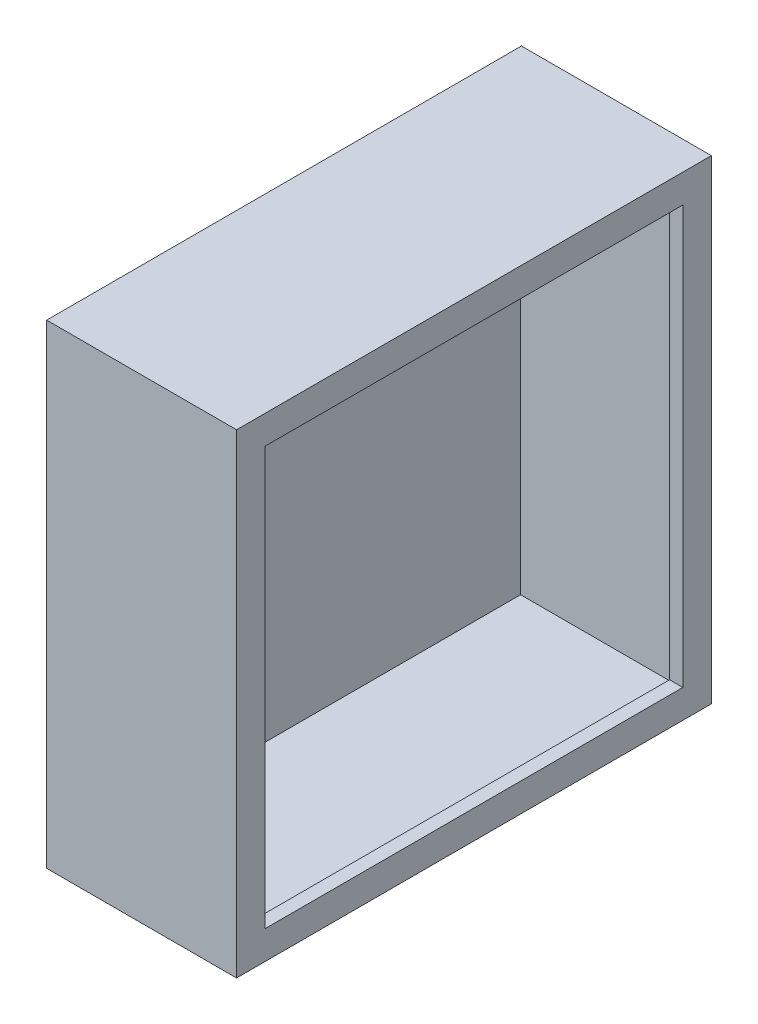
ISO-10303-21;
HEADER;
FILE_DESCRIPTION(('STEP AP214'),'2;1');
FILE_NAME('part.step','',(''),(''),'','','');
FILE_SCHEMA(('AUTOMOTIVE_DESIGN { 1 0 10303 214 1 1 1 1 }'));
ENDSEC;
DATA;
#1=APPLICATION_CONTEXT('core data for automotive mechanical design processes');
#2=APPLICATION_PROTOCOL_DEFINITION('international standard','automotive_design',2000,#1);
#3=PRODUCT_CONTEXT('',#1,'mechanical');
#4=PRODUCT('Part','Part','',(#3));
#5=PRODUCT_RELATED_PRODUCT_CATEGORY('part','',(#4));
#6=PRODUCT_DEFINITION_FORMATION('','',#4);
#7=PRODUCT_DEFINITION_CONTEXT('part definition',#1,'design');
#8=PRODUCT_DEFINITION('design','',#6,#7);
#9=PRODUCT_DEFINITION_SHAPE('','',#8);
#10=(LENGTH_UNIT() NAMED_UNIT(*) SI_UNIT(.MILLI.,.METRE.));
#11=(NAMED_UNIT(*) PLANE_ANGLE_UNIT() SI_UNIT($,.RADIAN.));
#12=(NAMED_UNIT(*) SI_UNIT($,.STERADIAN.) SOLID_ANGLE_UNIT());
#13=UNCERTAINTY_MEASURE_WITH_UNIT(LENGTH_MEASURE(1.E-05),#10,'distance_accuracy_value','');
#14=(GEOMETRIC_REPRESENTATION_CONTEXT(3) GLOBAL_UNCERTAINTY_ASSIGNED_CONTEXT((#13)) GLOBAL_UNIT_ASSIGNED_CONTEXT((#10,
#11,#12)) REPRESENTATION_CONTEXT('',''));
#15=CARTESIAN_POINT('',(0.,0.,0.));
#16=DIRECTION('',(0.,0.,1.));
#17=DIRECTION('',(1.,0.,0.));
#18=AXIS2_PLACEMENT_3D('',#15,#16,#17);
#19=CARTESIAN_POINT('',(40.,60.1781542541157,43.6548223350254));
#20=DIRECTION('',(0.,0.,-1.));
#21=DIRECTION('',(-1.,0.,0.));
#22=AXIS2_PLACEMENT_3D('',#19,#20,#21);
#23=PLANE('',#22);
#24=DIRECTION('',(-1.,0.,0.));
#25=VECTOR('',#24,1.);
#26=CARTESIAN_POINT('',(40.,-39.8218457458843,43.6548223350254));
#27=LINE('',#26,#25);
#28=CARTESIAN_POINT('',(40.,-39.8218457458843,43.6548223350254));
#29=VERTEX_POINT('',#28);
#30=CARTESIAN_POINT('',(0.,-39.8218457458843,43.6548223350254));
#31=VERTEX_POINT('',#30);
#32=EDGE_CURVE('E172',#29,#31,#27,.T.);
#33=ORIENTED_EDGE('',*,*,#32,.F.);
#34=DIRECTION('',(0.,-1.,0.));
#35=VECTOR('',#34,1.);
#36=CARTESIAN_POINT('',(40.,60.1781542541157,43.6548223350254));
#37=LINE('',#36,#35);
#38=CARTESIAN_POINT('',(40.,60.1781542541157,43.6548223350254));
#39=VERTEX_POINT('',#38);
#40=EDGE_CURVE('E187',#39,#29,#37,.T.);
#41=ORIENTED_EDGE('',*,*,#40,.F.);
#42=DIRECTION('',(-1.,0.,0.));
#43=VECTOR('',#42,1.);
#44=CARTESIAN_POINT('',(40.,60.1781542541157,43.6548223350254));
#45=LINE('',#44,#43);
#46=CARTESIAN_POINT('',(0.,60.1781542541157,43.6548223350254));
#47=VERTEX_POINT('',#46);
#48=EDGE_CURVE('E181',#39,#47,#45,.T.);
#49=ORIENTED_EDGE('',*,*,#48,.T.);
#50=DIRECTION('',(0.,-1.,0.));
#51=VECTOR('',#50,1.);
#52=CARTESIAN_POINT('',(0.,60.1781542541157,43.6548223350254));
#53=LINE('',#52,#51);
#54=EDGE_CURVE('E192',#47,#31,#53,.T.);
#55=ORIENTED_EDGE('',*,*,#54,.T.);
#56=EDGE_LOOP('',(#33,#41,#49,#55));
#57=FACE_BOUND('',#56,.T.);
#58=ADVANCED_FACE('F38',(#57),#23,.F.);
#59=CARTESIAN_POINT('',(40.,-39.8218457458843,43.6548223350254));
#60=DIRECTION('',(0.,1.,0.));
#61=DIRECTION('',(0.,0.,1.));
#62=AXIS2_PLACEMENT_3D('',#59,#60,#61);
#63=PLANE('',#62);
#64=DIRECTION('',(-1.,0.,0.));
#65=VECTOR('',#64,1.);
#66=CARTESIAN_POINT('',(40.,-39.8218457458843,-56.3451776649746));
#67=LINE('',#66,#65);
#68=CARTESIAN_POINT('',(40.,-39.8218457458843,-56.3451776649746));
#69=VERTEX_POINT('',#68);
#70=CARTESIAN_POINT('',(0.,-39.8218457458843,-56.3451776649746));
#71=VERTEX_POINT('',#70);
#72=EDGE_CURVE('E175',#69,#71,#67,.T.);
#73=ORIENTED_EDGE('',*,*,#72,.F.);
#74=DIRECTION('',(0.,0.,-1.));
#75=VECTOR('',#74,1.);
#76=CARTESIAN_POINT('',(40.,-39.8218457458843,43.6548223350254));
#77=LINE('',#76,#75);
#78=EDGE_CURVE('E199',#29,#69,#77,.T.);
#79=ORIENTED_EDGE('',*,*,#78,.F.);
#80=ORIENTED_EDGE('',*,*,#32,.T.);
#81=DIRECTION('',(0.,0.,-1.));
#82=VECTOR('',#81,1.);
#83=CARTESIAN_POINT('',(0.,-39.8218457458843,43.6548223350254));
#84=LINE('',#83,#82);
#85=EDGE_CURVE('E190',#31,#71,#84,.T.);
#86=ORIENTED_EDGE('',*,*,#85,.T.);
#87=EDGE_LOOP('',(#73,#79,#80,#86));
#88=FACE_BOUND('',#87,.T.);
#89=ADVANCED_FACE('F291',(#88),#63,.F.);
#90=CARTESIAN_POINT('',(40.,60.1781542541157,-56.3451776649746));
#91=DIRECTION('',(0.,0.,1.));
#92=DIRECTION('',(1.,0.,0.));
#93=AXIS2_PLACEMENT_3D('',#90,#91,#92);
#94=PLANE('',#93);
#95=DIRECTION('',(-1.,0.,0.));
#96=VECTOR('',#95,1.);
#97=CARTESIAN_POINT('',(40.,60.1781542541157,-56.3451776649746));
#98=LINE('',#97,#96);
#99=CARTESIAN_POINT('',(40.,60.1781542541157,-56.3451776649746));
#100=VERTEX_POINT('',#99);
#101=CARTESIAN_POINT('',(0.,60.1781542541157,-56.3451776649746));
#102=VERTEX_POINT('',#101);
#103=EDGE_CURVE('E178',#100,#102,#98,.T.);
#104=ORIENTED_EDGE('',*,*,#103,.F.);
#105=DIRECTION('',(0.,1.,0.));
#106=VECTOR('',#105,1.);
#107=CARTESIAN_POINT('',(40.,60.1781542541157,-56.3451776649746));
#108=LINE('',#107,#106);
#109=EDGE_CURVE('E197',#69,#100,#108,.T.);
#110=ORIENTED_EDGE('',*,*,#109,.F.);
#111=ORIENTED_EDGE('',*,*,#72,.T.);
#112=DIRECTION('',(0.,1.,0.));
#113=VECTOR('',#112,1.);
#114=CARTESIAN_POINT('',(0.,60.1781542541157,-56.3451776649746));
#115=LINE('',#114,#113);
#116=EDGE_CURVE('E188',#71,#102,#115,.T.);
#117=ORIENTED_EDGE('',*,*,#116,.T.);
#118=EDGE_LOOP('',(#104,#110,#111,#117));
#119=FACE_BOUND('',#118,.T.);
#120=ADVANCED_FACE('F296',(#119),#94,.F.);
#121=CARTESIAN_POINT('',(40.,60.1781542541157,43.6548223350254));
#122=DIRECTION('',(0.,-1.,0.));
#123=DIRECTION('',(0.,0.,-1.));
#124=AXIS2_PLACEMENT_3D('',#121,#122,#123);
#125=PLANE('',#124);
#126=ORIENTED_EDGE('',*,*,#48,.F.);
#127=DIRECTION('',(0.,0.,1.));
#128=VECTOR('',#127,1.);
#129=CARTESIAN_POINT('',(40.,60.1781542541157,43.6548223350254));
#130=LINE('',#129,#128);
#131=EDGE_CURVE('E184',#100,#39,#130,.T.);
#132=ORIENTED_EDGE('',*,*,#131,.F.);
#133=ORIENTED_EDGE('',*,*,#103,.T.);
#134=DIRECTION('',(0.,0.,1.));
#135=VECTOR('',#134,1.);
#136=CARTESIAN_POINT('',(0.,60.1781542541157,43.6548223350254));
#137=LINE('',#136,#135);
#138=EDGE_CURVE('E185',#102,#47,#137,.T.);
#139=ORIENTED_EDGE('',*,*,#138,.T.);
#140=EDGE_LOOP('',(#126,#132,#133,#139));
#141=FACE_BOUND('',#140,.T.);
#142=ADVANCED_FACE('F309',(#141),#125,.F.);
#143=CARTESIAN_POINT('',(40.,0.,0.));
#144=DIRECTION('',(1.,0.,0.));
#145=DIRECTION('',(0.,0.,-1.));
#146=AXIS2_PLACEMENT_3D('',#143,#144,#145);
#147=PLANE('',#146);
#148=ORIENTED_EDGE('',*,*,#131,.T.);
#149=ORIENTED_EDGE('',*,*,#40,.T.);
#150=ORIENTED_EDGE('',*,*,#78,.T.);
#151=ORIENTED_EDGE('',*,*,#109,.T.);
#152=EDGE_LOOP('',(#148,#149,#150,#151));
#153=FACE_BOUND('',#152,.T.);
#154=DIRECTION('',(0.,1.,0.));
#155=VECTOR('',#154,1.);
#156=CARTESIAN_POINT('',(40.,0.,37.6548223350254));
#157=LINE('',#156,#155);
#158=CARTESIAN_POINT('',(40.,-33.8218457458843,37.6548223350254));
#159=VERTEX_POINT('',#158);
#160=CARTESIAN_POINT('',(40.,54.1781542541157,37.6548223350254));
#161=VERTEX_POINT('',#160);
#162=EDGE_CURVE('E229',#159,#161,#157,.T.);
#163=ORIENTED_EDGE('',*,*,#162,.T.);
#164=DIRECTION('',(0.,0.,-1.));
#165=VECTOR('',#164,1.);
#166=CARTESIAN_POINT('',(40.,54.1781542541157,40.8361807320889));
#167=LINE('',#166,#165);
#168=CARTESIAN_POINT('',(40.,54.1781542541157,-50.3451776649746));
#169=VERTEX_POINT('',#168);
#170=EDGE_CURVE('E153',#161,#169,#167,.T.);
#171=ORIENTED_EDGE('',*,*,#170,.T.);
#172=DIRECTION('',(0.,-1.,0.));
#173=VECTOR('',#172,1.);
#174=CARTESIAN_POINT('',(40.,54.1781542541157,-50.3451776649746));
#175=LINE('',#174,#173);
#176=CARTESIAN_POINT('',(40.,-33.8218457458843,-50.3451776649746));
#177=VERTEX_POINT('',#176);
#178=EDGE_CURVE('E239',#169,#177,#175,.T.);
#179=ORIENTED_EDGE('',*,*,#178,.T.);
#180=DIRECTION('',(0.,0.,1.));
#181=VECTOR('',#180,1.);
#182=CARTESIAN_POINT('',(40.,-33.8218457458843,0.));
#183=LINE('',#182,#181);
#184=EDGE_CURVE('E253',#177,#159,#183,.T.);
#185=ORIENTED_EDGE('',*,*,#184,.T.);
#186=EDGE_LOOP('',(#163,#171,#179,#185));
#187=FACE_BOUND('',#186,.T.);
#188=ADVANCED_FACE('F264',(#153,#187),#147,.T.);
#189=CARTESIAN_POINT('',(0.,0.,0.));
#190=DIRECTION('',(1.,0.,0.));
#191=DIRECTION('',(0.,0.,-1.));
#192=AXIS2_PLACEMENT_3D('',#189,#190,#191);
#193=PLANE('',#192);
#194=ORIENTED_EDGE('',*,*,#54,.F.);
#195=ORIENTED_EDGE('',*,*,#138,.F.);
#196=ORIENTED_EDGE('',*,*,#116,.F.);
#197=ORIENTED_EDGE('',*,*,#85,.F.);
#198=EDGE_LOOP('',(#194,#195,#196,#197));
#199=FACE_BOUND('',#198,.T.);
#200=ADVANCED_FACE('F312',(#199),#193,.F.);
#201=CARTESIAN_POINT('',(2.99999999999998,57.1781542541157,-53.1638192679111));
#202=DIRECTION('',(0.,1.,0.));
#203=DIRECTION('',(0.,0.,1.));
#204=AXIS2_PLACEMENT_3D('',#201,#202,#203);
#205=PLANE('',#204);
#206=DIRECTION('',(1.,0.,0.));
#207=VECTOR('',#206,1.);
#208=CARTESIAN_POINT('',(2.99999999999998,57.1781542541157,-53.1638192679111));
#209=LINE('',#208,#207);
#210=CARTESIAN_POINT('',(2.99999999999998,57.1781542541157,-53.1638192679111));
#211=VERTEX_POINT('',#210);
#212=CARTESIAN_POINT('',(37.2048668452796,57.1781542541157,-53.1638192679111));
#213=VERTEX_POINT('',#212);
#214=EDGE_CURVE('E195',#211,#213,#209,.T.);
#215=ORIENTED_EDGE('',*,*,#214,.T.);
#216=DIRECTION('',(0.,0.,1.));
#217=VECTOR('',#216,1.);
#218=CARTESIAN_POINT('',(37.2048668452796,57.1781542541157,-53.1638192679111));
#219=LINE('',#218,#217);
#220=CARTESIAN_POINT('',(37.2048668452796,57.1781542541157,40.8361807320889));
#221=VERTEX_POINT('',#220);
#222=EDGE_CURVE('E161',#213,#221,#219,.T.);
#223=ORIENTED_EDGE('',*,*,#222,.T.);
#224=DIRECTION('',(1.,0.,0.));
#225=VECTOR('',#224,1.);
#226=CARTESIAN_POINT('',(2.99999999999998,57.1781542541157,40.8361807320889));
#227=LINE('',#226,#225);
#228=CARTESIAN_POINT('',(2.99999999999998,57.1781542541157,40.8361807320889));
#229=VERTEX_POINT('',#228);
#230=EDGE_CURVE('E160',#229,#221,#227,.T.);
#231=ORIENTED_EDGE('',*,*,#230,.F.);
#232=DIRECTION('',(0.,0.,1.));
#233=VECTOR('',#232,1.);
#234=CARTESIAN_POINT('',(2.99999999999998,57.1781542541157,-53.1638192679111));
#235=LINE('',#234,#233);
#236=EDGE_CURVE('E219',#211,#229,#235,.T.);
#237=ORIENTED_EDGE('',*,*,#236,.F.);
#238=EDGE_LOOP('',(#215,#223,#231,#237));
#239=FACE_BOUND('',#238,.T.);
#240=ADVANCED_FACE('F324',(#239),#205,.F.);
#241=CARTESIAN_POINT('',(2.99999999999998,-36.8218457458843,-53.1638192679111));
#242=DIRECTION('',(0.,0.,-1.));
#243=DIRECTION('',(0.,1.,0.));
#244=AXIS2_PLACEMENT_3D('',#241,#242,#243);
#245=PLANE('',#244);
#246=DIRECTION('',(0.,1.,0.));
#247=VECTOR('',#246,1.);
#248=CARTESIAN_POINT('',(37.2048668452796,-36.8218457458843,-53.1638192679111));
#249=LINE('',#248,#247);
#250=CARTESIAN_POINT('',(37.2048668452796,-36.8218457458843,-53.1638192679111));
#251=VERTEX_POINT('',#250);
#252=EDGE_CURVE('E11',#251,#213,#249,.T.);
#253=ORIENTED_EDGE('',*,*,#252,.T.);
#254=ORIENTED_EDGE('',*,*,#214,.F.);
#255=DIRECTION('',(0.,1.,0.));
#256=VECTOR('',#255,1.);
#257=CARTESIAN_POINT('',(2.99999999999998,-36.8218457458843,-53.1638192679111));
#258=LINE('',#257,#256);
#259=CARTESIAN_POINT('',(2.99999999999998,-36.8218457458843,-53.1638192679111));
#260=VERTEX_POINT('',#259);
#261=EDGE_CURVE('E204',#260,#211,#258,.T.);
#262=ORIENTED_EDGE('',*,*,#261,.F.);
#263=DIRECTION('',(1.,0.,0.));
#264=VECTOR('',#263,1.);
#265=CARTESIAN_POINT('',(2.99999999999998,-36.8218457458843,-53.1638192679111));
#266=LINE('',#265,#264);
#267=EDGE_CURVE('E206',#260,#251,#266,.T.);
#268=ORIENTED_EDGE('',*,*,#267,.T.);
#269=EDGE_LOOP('',(#253,#254,#262,#268));
#270=FACE_BOUND('',#269,.T.);
#271=ADVANCED_FACE('F329',(#270),#245,.F.);
#272=CARTESIAN_POINT('',(2.99999999999998,-36.8218457458843,40.8361807320889));
#273=DIRECTION('',(0.,-1.,0.));
#274=DIRECTION('',(0.,0.,-1.));
#275=AXIS2_PLACEMENT_3D('',#272,#273,#274);
#276=PLANE('',#275);
#277=DIRECTION('',(1.,0.,0.));
#278=VECTOR('',#277,1.);
#279=CARTESIAN_POINT('',(2.99999999999998,-36.8218457458843,40.8361807320889));
#280=LINE('',#279,#278);
#281=CARTESIAN_POINT('',(2.99999999999998,-36.8218457458843,40.8361807320889));
#282=VERTEX_POINT('',#281);
#283=CARTESIAN_POINT('',(37.2048668452796,-36.8218457458843,40.8361807320889));
#284=VERTEX_POINT('',#283);
#285=EDGE_CURVE('E203',#282,#284,#280,.T.);
#286=ORIENTED_EDGE('',*,*,#285,.T.);
#287=DIRECTION('',(0.,0.,-1.));
#288=VECTOR('',#287,1.);
#289=CARTESIAN_POINT('',(37.2048668452796,-36.8218457458843,40.8361807320889));
#290=LINE('',#289,#288);
#291=EDGE_CURVE('E250',#284,#251,#290,.T.);
#292=ORIENTED_EDGE('',*,*,#291,.T.);
#293=ORIENTED_EDGE('',*,*,#267,.F.);
#294=DIRECTION('',(0.,0.,-1.));
#295=VECTOR('',#294,1.);
#296=CARTESIAN_POINT('',(2.99999999999998,-36.8218457458843,40.8361807320889));
#297=LINE('',#296,#295);
#298=EDGE_CURVE('E213',#282,#260,#297,.T.);
#299=ORIENTED_EDGE('',*,*,#298,.F.);
#300=EDGE_LOOP('',(#286,#292,#293,#299));
#301=FACE_BOUND('',#300,.T.);
#302=ADVANCED_FACE('F334',(#301),#276,.F.);
#303=CARTESIAN_POINT('',(2.99999999999998,57.1781542541157,40.8361807320889));
#304=DIRECTION('',(0.,0.,1.));
#305=DIRECTION('',(1.,0.,0.));
#306=AXIS2_PLACEMENT_3D('',#303,#304,#305);
#307=PLANE('',#306);
#308=ORIENTED_EDGE('',*,*,#230,.T.);
#309=DIRECTION('',(0.,1.,0.));
#310=VECTOR('',#309,1.);
#311=CARTESIAN_POINT('',(37.2048668452796,54.1781542541157,40.8361807320889));
#312=LINE('',#311,#310);
#313=CARTESIAN_POINT('',(37.2048668452796,54.1781542541157,40.8361807320889));
#314=VERTEX_POINT('',#313);
#315=EDGE_CURVE('E146',#314,#221,#312,.T.);
#316=ORIENTED_EDGE('',*,*,#315,.F.);
#317=DIRECTION('',(-1.,0.,0.));
#318=VECTOR('',#317,1.);
#319=CARTESIAN_POINT('',(2.99999999999998,54.1781542541157,40.8361807320889));
#320=LINE('',#319,#318);
#321=CARTESIAN_POINT('',(37.,54.1781542541157,40.8361807320889));
#322=VERTEX_POINT('',#321);
#323=EDGE_CURVE('E45',#314,#322,#320,.T.);
#324=ORIENTED_EDGE('',*,*,#323,.T.);
#325=DIRECTION('',(0.,1.,0.));
#326=VECTOR('',#325,1.);
#327=CARTESIAN_POINT('',(37.,57.1781542541157,40.8361807320889));
#328=LINE('',#327,#326);
#329=CARTESIAN_POINT('',(37.,-33.8218457458843,40.8361807320889));
#330=VERTEX_POINT('',#329);
#331=EDGE_CURVE('E167',#330,#322,#328,.T.);
#332=ORIENTED_EDGE('',*,*,#331,.F.);
#333=DIRECTION('',(-1.,0.,0.));
#334=VECTOR('',#333,1.);
#335=CARTESIAN_POINT('',(2.99999999999998,-33.8218457458844,40.8361807320889));
#336=LINE('',#335,#334);
#337=CARTESIAN_POINT('',(37.2048668452796,-33.8218457458844,40.8361807320889));
#338=VERTEX_POINT('',#337);
#339=EDGE_CURVE('E168',#338,#330,#336,.T.);
#340=ORIENTED_EDGE('',*,*,#339,.F.);
#341=DIRECTION('',(0.,-1.,0.));
#342=VECTOR('',#341,1.);
#343=CARTESIAN_POINT('',(37.2048668452796,-33.8218457458843,40.8361807320889));
#344=LINE('',#343,#342);
#345=EDGE_CURVE('E58',#338,#284,#344,.T.);
#346=ORIENTED_EDGE('',*,*,#345,.T.);
#347=ORIENTED_EDGE('',*,*,#285,.F.);
#348=DIRECTION('',(0.,-1.,0.));
#349=VECTOR('',#348,1.);
#350=CARTESIAN_POINT('',(2.99999999999998,57.1781542541157,40.8361807320889));
#351=LINE('',#350,#349);
#352=EDGE_CURVE('E216',#229,#282,#351,.T.);
#353=ORIENTED_EDGE('',*,*,#352,.F.);
#354=EDGE_LOOP('',(#308,#316,#324,#332,#340,#346,#347,#353));
#355=FACE_BOUND('',#354,.T.);
#356=ADVANCED_FACE('F156',(#355),#307,.F.);
#357=CARTESIAN_POINT('',(2.99999999999998,0.,0.));
#358=DIRECTION('',(1.,0.,0.));
#359=DIRECTION('',(0.,0.,-1.));
#360=AXIS2_PLACEMENT_3D('',#357,#358,#359);
#361=PLANE('',#360);
#362=ORIENTED_EDGE('',*,*,#236,.T.);
#363=ORIENTED_EDGE('',*,*,#352,.T.);
#364=ORIENTED_EDGE('',*,*,#298,.T.);
#365=ORIENTED_EDGE('',*,*,#261,.T.);
#366=EDGE_LOOP('',(#362,#363,#364,#365));
#367=FACE_BOUND('',#366,.T.);
#368=ADVANCED_FACE('F333',(#367),#361,.T.);
#369=CARTESIAN_POINT('',(37.,0.,37.6548223350254));
#370=DIRECTION('',(1.,0.,0.));
#371=DIRECTION('',(0.,1.,0.));
#372=AXIS2_PLACEMENT_3D('',#369,#370,#371);
#373=PLANE('',#372);
#374=DIRECTION('',(0.,0.,1.));
#375=VECTOR('',#374,1.);
#376=CARTESIAN_POINT('',(37.,-33.8218457458843,37.6548223350254));
#377=LINE('',#376,#375);
#378=CARTESIAN_POINT('',(37.,-33.8218457458843,37.6548223350254));
#379=VERTEX_POINT('',#378);
#380=EDGE_CURVE('E222',#379,#330,#377,.T.);
#381=ORIENTED_EDGE('',*,*,#380,.T.);
#382=ORIENTED_EDGE('',*,*,#331,.T.);
#383=DIRECTION('',(0.,0.,1.));
#384=VECTOR('',#383,1.);
#385=CARTESIAN_POINT('',(37.,54.1781542541157,37.6548223350254));
#386=LINE('',#385,#384);
#387=CARTESIAN_POINT('',(37.,54.1781542541157,37.6548223350254));
#388=VERTEX_POINT('',#387);
#389=EDGE_CURVE('E166',#388,#322,#386,.T.);
#390=ORIENTED_EDGE('',*,*,#389,.F.);
#391=DIRECTION('',(0.,1.,0.));
#392=VECTOR('',#391,1.);
#393=CARTESIAN_POINT('',(37.,0.,37.6548223350254));
#394=LINE('',#393,#392);
#395=EDGE_CURVE('E236',#379,#388,#394,.T.);
#396=ORIENTED_EDGE('',*,*,#395,.F.);
#397=EDGE_LOOP('',(#381,#382,#390,#396));
#398=FACE_BOUND('',#397,.T.);
#399=ADVANCED_FACE('F280',(#398),#373,.F.);
#400=CARTESIAN_POINT('',(0.,54.1781542541157,37.6548223350254));
#401=DIRECTION('',(0.,1.,0.));
#402=DIRECTION('',(0.,0.,1.));
#403=AXIS2_PLACEMENT_3D('',#400,#401,#402);
#404=PLANE('',#403);
#405=DIRECTION('',(0.,0.,1.));
#406=VECTOR('',#405,1.);
#407=CARTESIAN_POINT('',(37.2048668452796,54.1781542541157,-53.1638192679111));
#408=LINE('',#407,#406);
#409=CARTESIAN_POINT('',(37.2048668452796,54.1781542541157,37.6548223350254));
#410=VERTEX_POINT('',#409);
#411=EDGE_CURVE('E143',#410,#314,#408,.T.);
#412=ORIENTED_EDGE('',*,*,#411,.F.);
#413=DIRECTION('',(-1.,0.,0.));
#414=VECTOR('',#413,1.);
#415=CARTESIAN_POINT('',(0.,54.1781542541157,37.6548223350254));
#416=LINE('',#415,#414);
#417=EDGE_CURVE('E228',#410,#388,#416,.T.);
#418=ORIENTED_EDGE('',*,*,#417,.T.);
#419=ORIENTED_EDGE('',*,*,#389,.T.);
#420=ORIENTED_EDGE('',*,*,#323,.F.);
#421=EDGE_LOOP('',(#412,#418,#419,#420));
#422=FACE_BOUND('',#421,.T.);
#423=ADVANCED_FACE('F164',(#422),#404,.T.);
#424=CARTESIAN_POINT('',(0.,-33.8218457458843,37.6548223350254));
#425=DIRECTION('',(0.,1.,0.));
#426=DIRECTION('',(0.,0.,1.));
#427=AXIS2_PLACEMENT_3D('',#424,#425,#426);
#428=PLANE('',#427);
#429=DIRECTION('',(-1.,0.,0.));
#430=VECTOR('',#429,1.);
#431=CARTESIAN_POINT('',(0.,-33.8218457458843,37.6548223350254));
#432=LINE('',#431,#430);
#433=CARTESIAN_POINT('',(37.2048668452796,-33.8218457458843,37.6548223350254));
#434=VERTEX_POINT('',#433);
#435=EDGE_CURVE('E235',#434,#379,#432,.T.);
#436=ORIENTED_EDGE('',*,*,#435,.F.);
#437=DIRECTION('',(0.,0.,-1.));
#438=VECTOR('',#437,1.);
#439=CARTESIAN_POINT('',(37.2048668452796,-33.8218457458843,0.));
#440=LINE('',#439,#438);
#441=EDGE_CURVE('E256',#338,#434,#440,.T.);
#442=ORIENTED_EDGE('',*,*,#441,.F.);
#443=ORIENTED_EDGE('',*,*,#339,.T.);
#444=ORIENTED_EDGE('',*,*,#380,.F.);
#445=EDGE_LOOP('',(#436,#442,#443,#444));
#446=FACE_BOUND('',#445,.T.);
#447=ADVANCED_FACE('F276',(#446),#428,.F.);
#448=CARTESIAN_POINT('',(0.,0.,37.6548223350254));
#449=DIRECTION('',(0.,0.,1.));
#450=DIRECTION('',(1.,0.,0.));
#451=AXIS2_PLACEMENT_3D('',#448,#449,#450);
#452=PLANE('',#451);
#453=ORIENTED_EDGE('',*,*,#395,.T.);
#454=ORIENTED_EDGE('',*,*,#417,.F.);
#455=EDGE_CURVE('E225',#161,#410,#416,.T.);
#456=ORIENTED_EDGE('',*,*,#455,.F.);
#457=ORIENTED_EDGE('',*,*,#162,.F.);
#458=EDGE_CURVE('E232',#159,#434,#432,.T.);
#459=ORIENTED_EDGE('',*,*,#458,.T.);
#460=ORIENTED_EDGE('',*,*,#435,.T.);
#461=EDGE_LOOP('',(#453,#454,#456,#457,#459,#460));
#462=FACE_BOUND('',#461,.T.);
#463=ADVANCED_FACE('F282',(#462),#452,.F.);
#464=CARTESIAN_POINT('',(37.2048668452796,-33.8218457458843,-50.3451776649746));
#465=DIRECTION('',(-1.,0.,0.));
#466=DIRECTION('',(0.,-1.,0.));
#467=AXIS2_PLACEMENT_3D('',#464,#465,#466);
#468=PLANE('',#467);
#469=ORIENTED_EDGE('',*,*,#252,.F.);
#470=ORIENTED_EDGE('',*,*,#291,.F.);
#471=ORIENTED_EDGE('',*,*,#345,.F.);
#472=ORIENTED_EDGE('',*,*,#441,.T.);
#473=CARTESIAN_POINT('',(37.2048668452796,-33.8218457458843,-50.3451776649746));
#474=VERTEX_POINT('',#473);
#475=EDGE_CURVE('E259',#434,#474,#440,.T.);
#476=ORIENTED_EDGE('',*,*,#475,.T.);
#477=DIRECTION('',(0.,1.,0.));
#478=VECTOR('',#477,1.);
#479=CARTESIAN_POINT('',(37.2048668452796,-33.8218457458843,-50.3451776649746));
#480=LINE('',#479,#478);
#481=CARTESIAN_POINT('',(37.2048668452796,54.1781542541157,-50.3451776649746));
#482=VERTEX_POINT('',#481);
#483=EDGE_CURVE('E245',#474,#482,#480,.T.);
#484=ORIENTED_EDGE('',*,*,#483,.T.);
#485=EDGE_CURVE('E149',#482,#410,#408,.T.);
#486=ORIENTED_EDGE('',*,*,#485,.T.);
#487=ORIENTED_EDGE('',*,*,#411,.T.);
#488=ORIENTED_EDGE('',*,*,#315,.T.);
#489=ORIENTED_EDGE('',*,*,#222,.F.);
#490=EDGE_LOOP('',(#469,#470,#471,#472,#476,#484,#486,#487,#488,#489));
#491=FACE_BOUND('',#490,.T.);
#492=ADVANCED_FACE('F145',(#491),#468,.T.);
#493=CARTESIAN_POINT('',(0.,0.,-50.3451776649746));
#494=DIRECTION('',(0.,0.,-1.));
#495=DIRECTION('',(-1.,0.,0.));
#496=AXIS2_PLACEMENT_3D('',#493,#494,#495);
#497=PLANE('',#496);
#498=DIRECTION('',(-1.,0.,0.));
#499=VECTOR('',#498,1.);
#500=CARTESIAN_POINT('',(40.,-33.8218457458843,-50.3451776649746));
#501=LINE('',#500,#499);
#502=EDGE_CURVE('E247',#177,#474,#501,.T.);
#503=ORIENTED_EDGE('',*,*,#502,.F.);
#504=ORIENTED_EDGE('',*,*,#178,.F.);
#505=DIRECTION('',(-1.,0.,0.));
#506=VECTOR('',#505,1.);
#507=CARTESIAN_POINT('',(40.,54.1781542541157,-50.3451776649746));
#508=LINE('',#507,#506);
#509=EDGE_CURVE('E242',#169,#482,#508,.T.);
#510=ORIENTED_EDGE('',*,*,#509,.T.);
#511=ORIENTED_EDGE('',*,*,#483,.F.);
#512=EDGE_LOOP('',(#503,#504,#510,#511));
#513=FACE_BOUND('',#512,.T.);
#514=ADVANCED_FACE('F269',(#513),#497,.F.);
#515=CARTESIAN_POINT('',(0.,-33.8218457458843,0.));
#516=DIRECTION('',(0.,-1.,0.));
#517=DIRECTION('',(0.,0.,-1.));
#518=AXIS2_PLACEMENT_3D('',#515,#516,#517);
#519=PLANE('',#518);
#520=ORIENTED_EDGE('',*,*,#475,.F.);
#521=ORIENTED_EDGE('',*,*,#458,.F.);
#522=ORIENTED_EDGE('',*,*,#184,.F.);
#523=ORIENTED_EDGE('',*,*,#502,.T.);
#524=EDGE_LOOP('',(#520,#521,#522,#523));
#525=FACE_BOUND('',#524,.T.);
#526=ADVANCED_FACE('F273',(#525),#519,.F.);
#527=CARTESIAN_POINT('',(0.,54.1781542541157,0.));
#528=DIRECTION('',(0.,1.,0.));
#529=DIRECTION('',(0.,0.,1.));
#530=AXIS2_PLACEMENT_3D('',#527,#528,#529);
#531=PLANE('',#530);
#532=ORIENTED_EDGE('',*,*,#170,.F.);
#533=ORIENTED_EDGE('',*,*,#455,.T.);
#534=ORIENTED_EDGE('',*,*,#485,.F.);
#535=ORIENTED_EDGE('',*,*,#509,.F.);
#536=EDGE_LOOP('',(#532,#533,#534,#535));
#537=FACE_BOUND('',#536,.T.);
#538=ADVANCED_FACE('F283',(#537),#531,.F.);
#539=CLOSED_SHELL('',(#58,#89,#120,#142,#188,#200,#240,#271,#302,#356,#368,#399,#423,#447,#463,
#492,#514,#526,#538));
#540=MANIFOLD_SOLID_BREP('B2',#539);
#541=ADVANCED_BREP_SHAPE_REPRESENTATION('',(#18,#540),#14);
#542=SHAPE_DEFINITION_REPRESENTATION(#9,#541);
ENDSEC;
END-ISO-10303-21;
